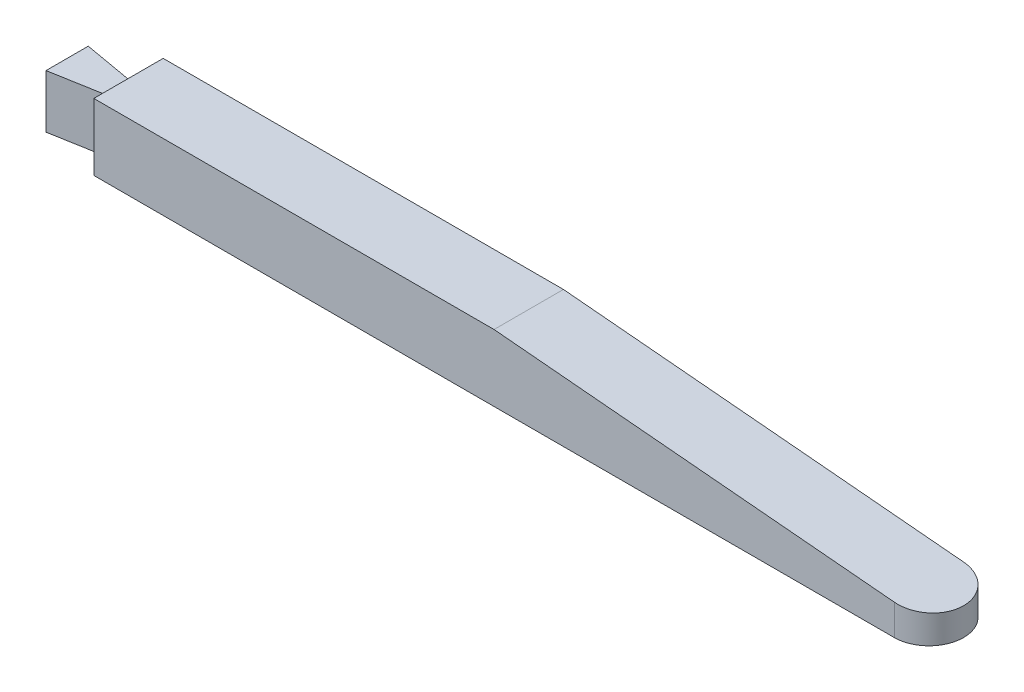
ISO-10303-21;
HEADER;
FILE_DESCRIPTION(('STEP AP214'),'2;1');
FILE_NAME('part.step','',(''),(''),'','','');
FILE_SCHEMA(('AUTOMOTIVE_DESIGN { 1 0 10303 214 1 1 1 1 }'));
ENDSEC;
DATA;
#1=APPLICATION_CONTEXT('core data for automotive mechanical design processes');
#2=APPLICATION_PROTOCOL_DEFINITION('international standard','automotive_design',2000,#1);
#3=PRODUCT_CONTEXT('',#1,'mechanical');
#4=PRODUCT('Part','Part','',(#3));
#5=PRODUCT_RELATED_PRODUCT_CATEGORY('part','',(#4));
#6=PRODUCT_DEFINITION_FORMATION('','',#4);
#7=PRODUCT_DEFINITION_CONTEXT('part definition',#1,'design');
#8=PRODUCT_DEFINITION('design','',#6,#7);
#9=PRODUCT_DEFINITION_SHAPE('','',#8);
#10=(LENGTH_UNIT() NAMED_UNIT(*) SI_UNIT(.MILLI.,.METRE.));
#11=(NAMED_UNIT(*) PLANE_ANGLE_UNIT() SI_UNIT($,.RADIAN.));
#12=(NAMED_UNIT(*) SI_UNIT($,.STERADIAN.) SOLID_ANGLE_UNIT());
#13=UNCERTAINTY_MEASURE_WITH_UNIT(LENGTH_MEASURE(1.E-05),#10,'distance_accuracy_value','');
#14=(GEOMETRIC_REPRESENTATION_CONTEXT(3) GLOBAL_UNCERTAINTY_ASSIGNED_CONTEXT((#13)) GLOBAL_UNIT_ASSIGNED_CONTEXT((#10,
#11,#12)) REPRESENTATION_CONTEXT('',''));
#15=CARTESIAN_POINT('',(0.,0.,0.));
#16=DIRECTION('',(0.,0.,1.));
#17=DIRECTION('',(1.,0.,0.));
#18=AXIS2_PLACEMENT_3D('',#15,#16,#17);
#19=CARTESIAN_POINT('',(-13.5492408882498,38.1,8.6448900000001));
#20=DIRECTION('',(-0.173648177666927,0.,0.984807753012209));
#21=DIRECTION('',(0.984807753012209,0.,0.173648177666927));
#22=AXIS2_PLACEMENT_3D('',#19,#20,#21);
#23=PLANE('',#22);
#24=DIRECTION('',(-0.984807753012209,0.,-0.173648177666927));
#25=VECTOR('',#24,1.);
#26=CARTESIAN_POINT('',(21.5027591117502,30.48,14.8255033277931));
#27=LINE('',#26,#25);
#28=CARTESIAN_POINT('',(21.5027591117502,30.48,14.8255033277931));
#29=VERTEX_POINT('',#28);
#30=CARTESIAN_POINT('',(-13.5492408882498,30.48,8.6448900000001));
#31=VERTEX_POINT('',#30);
#32=EDGE_CURVE('E198',#29,#31,#27,.T.);
#33=ORIENTED_EDGE('',*,*,#32,.F.);
#34=DIRECTION('',(0.,-1.,0.));
#35=VECTOR('',#34,1.);
#36=CARTESIAN_POINT('',(21.5027591117502,38.1,14.8255033277931));
#37=LINE('',#36,#35);
#38=CARTESIAN_POINT('',(21.5027591117502,0.,14.8255033277931));
#39=VERTEX_POINT('',#38);
#40=EDGE_CURVE('E11',#29,#39,#37,.T.);
#41=ORIENTED_EDGE('',*,*,#40,.T.);
#42=DIRECTION('',(-0.984807753012209,0.,-0.173648177666927));
#43=VECTOR('',#42,1.);
#44=CARTESIAN_POINT('',(-13.5492408882498,0.,8.6448900000001));
#45=LINE('',#44,#43);
#46=CARTESIAN_POINT('',(-13.5492408882498,0.,8.6448900000001));
#47=VERTEX_POINT('',#46);
#48=EDGE_CURVE('E124',#39,#47,#45,.T.);
#49=ORIENTED_EDGE('',*,*,#48,.T.);
#50=DIRECTION('',(0.,-1.,0.));
#51=VECTOR('',#50,1.);
#52=CARTESIAN_POINT('',(-13.5492408882498,38.1,8.6448900000001));
#53=LINE('',#52,#51);
#54=EDGE_CURVE('E53',#31,#47,#53,.T.);
#55=ORIENTED_EDGE('',*,*,#54,.F.);
#56=EDGE_LOOP('',(#33,#41,#49,#55));
#57=FACE_BOUND('',#56,.T.);
#58=ADVANCED_FACE('F45',(#57),#23,.F.);
#59=CARTESIAN_POINT('',(-13.5492408882498,38.1,8.6448900000001));
#60=DIRECTION('',(1.,0.,0.));
#61=DIRECTION('',(0.,0.,-1.));
#62=AXIS2_PLACEMENT_3D('',#59,#60,#61);
#63=PLANE('',#62);
#64=DIRECTION('',(0.,0.,1.));
#65=VECTOR('',#64,1.);
#66=CARTESIAN_POINT('',(-13.5492408882498,30.48,8.6448900000001));
#67=LINE('',#66,#65);
#68=CARTESIAN_POINT('',(-13.5492408882498,30.48,32.7748900000001));
#69=VERTEX_POINT('',#68);
#70=EDGE_CURVE('E177',#31,#69,#67,.T.);
#71=ORIENTED_EDGE('',*,*,#70,.F.);
#72=ORIENTED_EDGE('',*,*,#54,.T.);
#73=DIRECTION('',(0.,0.,1.));
#74=VECTOR('',#73,1.);
#75=CARTESIAN_POINT('',(-13.5492408882498,0.,8.6448900000001));
#76=LINE('',#75,#74);
#77=CARTESIAN_POINT('',(-13.5492408882498,0.,32.7748900000001));
#78=VERTEX_POINT('',#77);
#79=EDGE_CURVE('E130',#47,#78,#76,.T.);
#80=ORIENTED_EDGE('',*,*,#79,.T.);
#81=DIRECTION('',(0.,-1.,0.));
#82=VECTOR('',#81,1.);
#83=CARTESIAN_POINT('',(-13.5492408882498,38.1,32.7748900000001));
#84=LINE('',#83,#82);
#85=EDGE_CURVE('E166',#69,#78,#84,.T.);
#86=ORIENTED_EDGE('',*,*,#85,.F.);
#87=EDGE_LOOP('',(#71,#72,#80,#86));
#88=FACE_BOUND('',#87,.T.);
#89=ADVANCED_FACE('F172',(#88),#63,.F.);
#90=CARTESIAN_POINT('',(-13.5492408882498,38.1,32.7748900000001));
#91=DIRECTION('',(-0.173648177666935,0.,-0.984807753012207));
#92=DIRECTION('',(-0.984807753012207,0.,0.173648177666935));
#93=AXIS2_PLACEMENT_3D('',#90,#91,#92);
#94=PLANE('',#93);
#95=DIRECTION('',(0.984807753012207,0.,-0.173648177666935));
#96=VECTOR('',#95,1.);
#97=CARTESIAN_POINT('',(-13.5492408882498,30.48,32.7748900000001));
#98=LINE('',#97,#96);
#99=CARTESIAN_POINT('',(21.5027591117502,30.48,26.5942766722068));
#100=VERTEX_POINT('',#99);
#101=EDGE_CURVE('E133',#69,#100,#98,.T.);
#102=ORIENTED_EDGE('',*,*,#101,.F.);
#103=ORIENTED_EDGE('',*,*,#85,.T.);
#104=DIRECTION('',(0.984807753012207,0.,-0.173648177666935));
#105=VECTOR('',#104,1.);
#106=CARTESIAN_POINT('',(-13.5492408882498,0.,32.7748900000001));
#107=LINE('',#106,#105);
#108=CARTESIAN_POINT('',(21.5027591117502,0.,26.5942766722068));
#109=VERTEX_POINT('',#108);
#110=EDGE_CURVE('E141',#78,#109,#107,.T.);
#111=ORIENTED_EDGE('',*,*,#110,.T.);
#112=DIRECTION('',(0.,-1.,0.));
#113=VECTOR('',#112,1.);
#114=CARTESIAN_POINT('',(21.5027591117502,38.1,26.5942766722068));
#115=LINE('',#114,#113);
#116=EDGE_CURVE('E163',#100,#109,#115,.T.);
#117=ORIENTED_EDGE('',*,*,#116,.F.);
#118=EDGE_LOOP('',(#102,#103,#111,#117));
#119=FACE_BOUND('',#118,.T.);
#120=ADVANCED_FACE('F185',(#119),#94,.F.);
#121=CARTESIAN_POINT('',(21.5027591117502,38.1,40.5218900000002));
#122=DIRECTION('',(1.,0.,0.));
#123=DIRECTION('',(0.,0.,-1.));
#124=AXIS2_PLACEMENT_3D('',#121,#122,#123);
#125=PLANE('',#124);
#126=DIRECTION('',(0.,0.,1.));
#127=VECTOR('',#126,1.);
#128=CARTESIAN_POINT('',(21.5027591117502,0.,40.5218900000002));
#129=LINE('',#128,#127);
#130=CARTESIAN_POINT('',(21.5027591117502,0.,40.5218900000002));
#131=VERTEX_POINT('',#130);
#132=EDGE_CURVE('E145',#109,#131,#129,.T.);
#133=ORIENTED_EDGE('',*,*,#132,.T.);
#134=DIRECTION('',(0.,-1.,0.));
#135=VECTOR('',#134,1.);
#136=CARTESIAN_POINT('',(21.5027591117502,38.1,40.5218900000002));
#137=LINE('',#136,#135);
#138=CARTESIAN_POINT('',(21.5027591117502,38.1,40.5218900000002));
#139=VERTEX_POINT('',#138);
#140=EDGE_CURVE('E159',#139,#131,#137,.T.);
#141=ORIENTED_EDGE('',*,*,#140,.F.);
#142=DIRECTION('',(0.,0.,1.));
#143=VECTOR('',#142,1.);
#144=CARTESIAN_POINT('',(21.5027591117502,38.1,0.897890000000207));
#145=LINE('',#144,#143);
#146=CARTESIAN_POINT('',(21.5027591117502,38.1,0.897890000000207));
#147=VERTEX_POINT('',#146);
#148=EDGE_CURVE('E109',#147,#139,#145,.T.);
#149=ORIENTED_EDGE('',*,*,#148,.F.);
#150=DIRECTION('',(0.,-1.,0.));
#151=VECTOR('',#150,1.);
#152=CARTESIAN_POINT('',(21.5027591117502,38.1,0.897890000000207));
#153=LINE('',#152,#151);
#154=CARTESIAN_POINT('',(21.5027591117502,0.,0.897890000000207));
#155=VERTEX_POINT('',#154);
#156=EDGE_CURVE('E100',#147,#155,#153,.T.);
#157=ORIENTED_EDGE('',*,*,#156,.T.);
#158=DIRECTION('',(0.,0.,1.));
#159=VECTOR('',#158,1.);
#160=CARTESIAN_POINT('',(21.5027591117502,0.,0.897890000000207));
#161=LINE('',#160,#159);
#162=EDGE_CURVE('E116',#155,#39,#161,.T.);
#163=ORIENTED_EDGE('',*,*,#162,.T.);
#164=ORIENTED_EDGE('',*,*,#40,.F.);
#165=DIRECTION('',(0.,0.,-1.));
#166=VECTOR('',#165,1.);
#167=CARTESIAN_POINT('',(21.5027591117502,30.48,26.5942766722068));
#168=LINE('',#167,#166);
#169=EDGE_CURVE('E126',#100,#29,#168,.T.);
#170=ORIENTED_EDGE('',*,*,#169,.F.);
#171=ORIENTED_EDGE('',*,*,#116,.T.);
#172=EDGE_LOOP('',(#133,#141,#149,#157,#163,#164,#170,#171));
#173=FACE_BOUND('',#172,.T.);
#174=ADVANCED_FACE('F114',(#173),#125,.F.);
#175=CARTESIAN_POINT('',(21.5027591117502,38.1,40.5218900000002));
#176=DIRECTION('',(0.,0.,-1.));
#177=DIRECTION('',(-1.,0.,0.));
#178=AXIS2_PLACEMENT_3D('',#175,#176,#177);
#179=PLANE('',#178);
#180=DIRECTION('',(0.,-1.,0.));
#181=VECTOR('',#180,1.);
#182=CARTESIAN_POINT('',(478.70275911175,38.1,40.5218900000002));
#183=LINE('',#182,#181);
#184=CARTESIAN_POINT('',(478.70275911175,17.555725139289,40.5218900000002));
#185=VERTEX_POINT('',#184);
#186=CARTESIAN_POINT('',(478.70275911175,0.,40.5218900000002));
#187=VERTEX_POINT('',#186);
#188=EDGE_CURVE('E156',#185,#187,#183,.T.);
#189=ORIENTED_EDGE('',*,*,#188,.F.);
#190=DIRECTION('',(0.995985992739676,-0.0895092300623887,0.));
#191=VECTOR('',#190,1.);
#192=CARTESIAN_POINT('',(250.10275911175,38.1,40.5218900000002));
#193=LINE('',#192,#191);
#194=CARTESIAN_POINT('',(250.10275911175,38.1,40.5218900000002));
#195=VERTEX_POINT('',#194);
#196=EDGE_CURVE('E227',#195,#185,#193,.T.);
#197=ORIENTED_EDGE('',*,*,#196,.F.);
#198=DIRECTION('',(1.,0.,0.));
#199=VECTOR('',#198,1.);
#200=CARTESIAN_POINT('',(21.5027591117502,38.1,40.5218900000002));
#201=LINE('',#200,#199);
#202=EDGE_CURVE('E213',#139,#195,#201,.T.);
#203=ORIENTED_EDGE('',*,*,#202,.F.);
#204=ORIENTED_EDGE('',*,*,#140,.T.);
#205=DIRECTION('',(1.,0.,0.));
#206=VECTOR('',#205,1.);
#207=CARTESIAN_POINT('',(21.5027591117502,0.,40.5218900000002));
#208=LINE('',#207,#206);
#209=EDGE_CURVE('E148',#131,#187,#208,.T.);
#210=ORIENTED_EDGE('',*,*,#209,.T.);
#211=EDGE_LOOP('',(#189,#197,#203,#204,#210));
#212=FACE_BOUND('',#211,.T.);
#213=ADVANCED_FACE('F225',(#212),#179,.F.);
#214=CARTESIAN_POINT('',(478.70275911175,38.1,20.7098900000002));
#215=DIRECTION('',(0.,-1.,0.));
#216=DIRECTION('',(0.,0.,-1.));
#217=AXIS2_PLACEMENT_3D('',#214,#215,#216);
#218=CYLINDRICAL_SURFACE('',#217,19.812);
#219=CARTESIAN_POINT('',(478.70275911175,17.555725139289,20.7098900000002));
#220=DIRECTION('',(-0.0895092300623887,-0.995985992739676,0.));
#221=DIRECTION('',(0.995985992739676,-0.0895092300623887,0.));
#222=AXIS2_PLACEMENT_3D('',#219,#220,#221);
#223=ELLIPSE('',#222,19.8918460143227,19.812);
#224=CARTESIAN_POINT('',(478.70275911175,17.555725139289,0.8978900000002));
#225=VERTEX_POINT('',#224);
#226=EDGE_CURVE('E200',#225,#185,#223,.T.);
#227=ORIENTED_EDGE('',*,*,#226,.T.);
#228=ORIENTED_EDGE('',*,*,#188,.T.);
#229=CARTESIAN_POINT('',(478.70275911175,0.,20.7098900000002));
#230=DIRECTION('',(0.,1.,0.));
#231=DIRECTION('',(0.,0.,1.));
#232=AXIS2_PLACEMENT_3D('',#229,#230,#231);
#233=CIRCLE('',#232,19.812);
#234=CARTESIAN_POINT('',(478.70275911175,0.,0.897890000000207));
#235=VERTEX_POINT('',#234);
#236=EDGE_CURVE('E110',#187,#235,#233,.T.);
#237=ORIENTED_EDGE('',*,*,#236,.T.);
#238=DIRECTION('',(0.,-1.,0.));
#239=VECTOR('',#238,1.);
#240=CARTESIAN_POINT('',(478.70275911175,38.1,0.897890000000207));
#241=LINE('',#240,#239);
#242=EDGE_CURVE('E103',#225,#235,#241,.T.);
#243=ORIENTED_EDGE('',*,*,#242,.F.);
#244=EDGE_LOOP('',(#227,#228,#237,#243));
#245=FACE_BOUND('',#244,.T.);
#246=ADVANCED_FACE('F255',(#245),#218,.T.);
#247=CARTESIAN_POINT('',(21.5027591117502,38.1,0.897890000000207));
#248=DIRECTION('',(0.,0.,1.));
#249=DIRECTION('',(1.,0.,0.));
#250=AXIS2_PLACEMENT_3D('',#247,#248,#249);
#251=PLANE('',#250);
#252=DIRECTION('',(-1.,0.,0.));
#253=VECTOR('',#252,1.);
#254=CARTESIAN_POINT('',(21.5027591117502,38.1,0.897890000000207));
#255=LINE('',#254,#253);
#256=CARTESIAN_POINT('',(250.10275911175,38.1,0.897890000000207));
#257=VERTEX_POINT('',#256);
#258=EDGE_CURVE('E68',#257,#147,#255,.T.);
#259=ORIENTED_EDGE('',*,*,#258,.F.);
#260=DIRECTION('',(0.995985992739676,-0.0895092300623887,0.));
#261=VECTOR('',#260,1.);
#262=CARTESIAN_POINT('',(250.10275911175,38.1,0.8978900000002));
#263=LINE('',#262,#261);
#264=EDGE_CURVE('E60',#257,#225,#263,.T.);
#265=ORIENTED_EDGE('',*,*,#264,.T.);
#266=ORIENTED_EDGE('',*,*,#242,.T.);
#267=DIRECTION('',(-1.,0.,0.));
#268=VECTOR('',#267,1.);
#269=CARTESIAN_POINT('',(21.5027591117502,0.,0.897890000000207));
#270=LINE('',#269,#268);
#271=EDGE_CURVE('E97',#235,#155,#270,.T.);
#272=ORIENTED_EDGE('',*,*,#271,.T.);
#273=ORIENTED_EDGE('',*,*,#156,.F.);
#274=EDGE_LOOP('',(#259,#265,#266,#272,#273));
#275=FACE_BOUND('',#274,.T.);
#276=ADVANCED_FACE('F99',(#275),#251,.F.);
#277=CARTESIAN_POINT('',(478.70275911175,38.1,20.7098900000002));
#278=DIRECTION('',(0.,1.,0.));
#279=DIRECTION('',(0.,0.,1.));
#280=AXIS2_PLACEMENT_3D('',#277,#278,#279);
#281=PLANE('',#280);
#282=DIRECTION('',(0.,0.,1.));
#283=VECTOR('',#282,1.);
#284=CARTESIAN_POINT('',(250.10275911175,38.1,0.8978900000002));
#285=LINE('',#284,#283);
#286=EDGE_CURVE('E206',#257,#195,#285,.T.);
#287=ORIENTED_EDGE('',*,*,#286,.F.);
#288=ORIENTED_EDGE('',*,*,#258,.T.);
#289=ORIENTED_EDGE('',*,*,#148,.T.);
#290=ORIENTED_EDGE('',*,*,#202,.T.);
#291=EDGE_LOOP('',(#287,#288,#289,#290));
#292=FACE_BOUND('',#291,.T.);
#293=ADVANCED_FACE('F219',(#292),#281,.T.);
#294=CARTESIAN_POINT('',(478.70275911175,0.,20.7098900000002));
#295=DIRECTION('',(0.,1.,0.));
#296=DIRECTION('',(0.,0.,1.));
#297=AXIS2_PLACEMENT_3D('',#294,#295,#296);
#298=PLANE('',#297);
#299=ORIENTED_EDGE('',*,*,#162,.F.);
#300=ORIENTED_EDGE('',*,*,#271,.F.);
#301=ORIENTED_EDGE('',*,*,#236,.F.);
#302=ORIENTED_EDGE('',*,*,#209,.F.);
#303=ORIENTED_EDGE('',*,*,#132,.F.);
#304=ORIENTED_EDGE('',*,*,#110,.F.);
#305=ORIENTED_EDGE('',*,*,#79,.F.);
#306=ORIENTED_EDGE('',*,*,#48,.F.);
#307=EDGE_LOOP('',(#299,#300,#301,#302,#303,#304,#305,#306));
#308=FACE_BOUND('',#307,.T.);
#309=ADVANCED_FACE('F121',(#308),#298,.F.);
#310=CARTESIAN_POINT('',(0.,30.48,0.));
#311=DIRECTION('',(0.,1.,0.));
#312=DIRECTION('',(0.,0.,1.));
#313=AXIS2_PLACEMENT_3D('',#310,#311,#312);
#314=PLANE('',#313);
#315=ORIENTED_EDGE('',*,*,#32,.T.);
#316=ORIENTED_EDGE('',*,*,#70,.T.);
#317=ORIENTED_EDGE('',*,*,#101,.T.);
#318=ORIENTED_EDGE('',*,*,#169,.T.);
#319=EDGE_LOOP('',(#315,#316,#317,#318));
#320=FACE_BOUND('',#319,.T.);
#321=ADVANCED_FACE('F197',(#320),#314,.T.);
#322=CARTESIAN_POINT('',(250.10275911175,38.1,0.8978900000002));
#323=DIRECTION('',(-0.0895092300623887,-0.995985992739676,0.));
#324=DIRECTION('',(0.995985992739676,-0.0895092300623887,0.));
#325=AXIS2_PLACEMENT_3D('',#322,#323,#324);
#326=PLANE('',#325);
#327=ORIENTED_EDGE('',*,*,#226,.F.);
#328=ORIENTED_EDGE('',*,*,#264,.F.);
#329=ORIENTED_EDGE('',*,*,#286,.T.);
#330=ORIENTED_EDGE('',*,*,#196,.T.);
#331=EDGE_LOOP('',(#327,#328,#329,#330));
#332=FACE_BOUND('',#331,.T.);
#333=ADVANCED_FACE('F233',(#332),#326,.F.);
#334=CLOSED_SHELL('',(#58,#89,#120,#174,#213,#246,#276,#293,#309,#321,#333));
#335=MANIFOLD_SOLID_BREP('B2',#334);
#336=ADVANCED_BREP_SHAPE_REPRESENTATION('',(#18,#335),#14);
#337=SHAPE_DEFINITION_REPRESENTATION(#9,#336);
ENDSEC;
END-ISO-10303-21;
